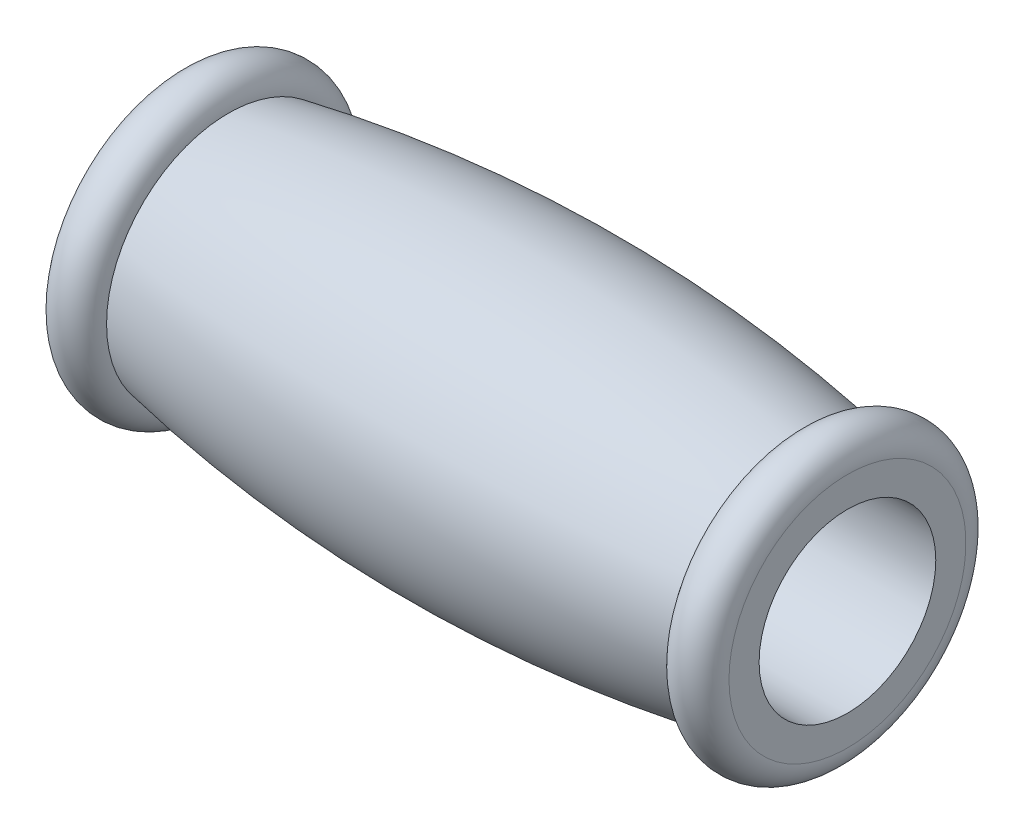
ISO-10303-21;
HEADER;
FILE_DESCRIPTION(('STEP AP214'),'2;1');
FILE_NAME('part.step','',(''),(''),'','','');
FILE_SCHEMA(('AUTOMOTIVE_DESIGN { 1 0 10303 214 1 1 1 1 }'));
ENDSEC;
DATA;
#1=APPLICATION_CONTEXT('core data for automotive mechanical design processes');
#2=APPLICATION_PROTOCOL_DEFINITION('international standard','automotive_design',2000,#1);
#3=PRODUCT_CONTEXT('',#1,'mechanical');
#4=PRODUCT('Part','Part','',(#3));
#5=PRODUCT_RELATED_PRODUCT_CATEGORY('part','',(#4));
#6=PRODUCT_DEFINITION_FORMATION('','',#4);
#7=PRODUCT_DEFINITION_CONTEXT('part definition',#1,'design');
#8=PRODUCT_DEFINITION('design','',#6,#7);
#9=PRODUCT_DEFINITION_SHAPE('','',#8);
#10=(LENGTH_UNIT() NAMED_UNIT(*) SI_UNIT(.MILLI.,.METRE.));
#11=(NAMED_UNIT(*) PLANE_ANGLE_UNIT() SI_UNIT($,.RADIAN.));
#12=(NAMED_UNIT(*) SI_UNIT($,.STERADIAN.) SOLID_ANGLE_UNIT());
#13=UNCERTAINTY_MEASURE_WITH_UNIT(LENGTH_MEASURE(1.E-05),#10,'distance_accuracy_value','');
#14=(GEOMETRIC_REPRESENTATION_CONTEXT(3) GLOBAL_UNCERTAINTY_ASSIGNED_CONTEXT((#13)) GLOBAL_UNIT_ASSIGNED_CONTEXT((#10,
#11,#12)) REPRESENTATION_CONTEXT('',''));
#15=CARTESIAN_POINT('',(0.,0.,0.));
#16=DIRECTION('',(0.,0.,1.));
#17=DIRECTION('',(1.,0.,0.));
#18=AXIS2_PLACEMENT_3D('',#15,#16,#17);
#19=CARTESIAN_POINT('',(-50.,13.2,0.));
#20=DIRECTION('',(1.,0.,0.));
#21=DIRECTION('',(0.,0.,-1.));
#22=AXIS2_PLACEMENT_3D('',#19,#20,#21);
#23=PLANE('',#22);
#24=CARTESIAN_POINT('',(-50.,0.,0.));
#25=DIRECTION('',(-1.,0.,0.));
#26=DIRECTION('',(0.,0.,1.));
#27=AXIS2_PLACEMENT_3D('',#24,#25,#26);
#28=CIRCLE('',#27,13.2);
#29=CARTESIAN_POINT('',(-50.,0.,13.2));
#30=VERTEX_POINT('',#29);
#31=EDGE_CURVE('E10',#30,#30,#28,.T.);
#32=ORIENTED_EDGE('',*,*,#31,.F.);
#33=EDGE_LOOP('',(#32));
#34=FACE_BOUND('',#33,.T.);
#35=CARTESIAN_POINT('',(-50.,0.,0.));
#36=DIRECTION('',(-1.,0.,0.));
#37=DIRECTION('',(0.,0.,1.));
#38=AXIS2_PLACEMENT_3D('',#35,#36,#37);
#39=CIRCLE('',#38,18.2);
#40=CARTESIAN_POINT('',(-50.,0.,18.2));
#41=VERTEX_POINT('',#40);
#42=EDGE_CURVE('E62',#41,#41,#39,.T.);
#43=ORIENTED_EDGE('',*,*,#42,.T.);
#44=EDGE_LOOP('',(#43));
#45=FACE_BOUND('',#44,.T.);
#46=ADVANCED_FACE('F39',(#34,#45),#23,.F.);
#47=CARTESIAN_POINT('',(-100.,0.,0.));
#48=DIRECTION('',(-1.,0.,0.));
#49=DIRECTION('',(0.,0.,1.));
#50=AXIS2_PLACEMENT_3D('',#47,#48,#49);
#51=CYLINDRICAL_SURFACE('',#50,13.2);
#52=CARTESIAN_POINT('',(50.,0.,0.));
#53=DIRECTION('',(-1.,0.,0.));
#54=DIRECTION('',(0.,0.,1.));
#55=AXIS2_PLACEMENT_3D('',#52,#53,#54);
#56=CIRCLE('',#55,13.2);
#57=CARTESIAN_POINT('',(50.,0.,13.2));
#58=VERTEX_POINT('',#57);
#59=EDGE_CURVE('E44',#58,#58,#56,.T.);
#60=ORIENTED_EDGE('',*,*,#59,.F.);
#61=EDGE_LOOP('',(#60));
#62=FACE_BOUND('',#61,.T.);
#63=ORIENTED_EDGE('',*,*,#31,.T.);
#64=EDGE_LOOP('',(#63));
#65=FACE_BOUND('',#64,.T.);
#66=ADVANCED_FACE('F88',(#62,#65),#51,.F.);
#67=CARTESIAN_POINT('',(50.,13.2,0.));
#68=DIRECTION('',(-1.,0.,0.));
#69=DIRECTION('',(0.,0.,1.));
#70=AXIS2_PLACEMENT_3D('',#67,#68,#69);
#71=PLANE('',#70);
#72=CARTESIAN_POINT('',(50.,0.,0.));
#73=DIRECTION('',(-1.,0.,0.));
#74=DIRECTION('',(0.,0.,1.));
#75=AXIS2_PLACEMENT_3D('',#72,#73,#74);
#76=CIRCLE('',#75,17.7);
#77=CARTESIAN_POINT('',(50.,0.,17.7));
#78=VERTEX_POINT('',#77);
#79=EDGE_CURVE('E47',#78,#78,#76,.T.);
#80=ORIENTED_EDGE('',*,*,#79,.F.);
#81=EDGE_LOOP('',(#80));
#82=FACE_BOUND('',#81,.T.);
#83=ORIENTED_EDGE('',*,*,#59,.T.);
#84=EDGE_LOOP('',(#83));
#85=FACE_BOUND('',#84,.T.);
#86=ADVANCED_FACE('F82',(#82,#85),#71,.F.);
#87=CARTESIAN_POINT('',(46.25,0.,0.));
#88=DIRECTION('',(-1.,0.,0.));
#89=DIRECTION('',(0.,0.,1.));
#90=AXIS2_PLACEMENT_3D('',#87,#88,#89);
#91=TOROIDAL_SURFACE('',#90,17.95,3.75832409459322);
#92=CARTESIAN_POINT('',(42.5,0.,0.));
#93=DIRECTION('',(-1.,0.,0.));
#94=DIRECTION('',(0.,0.,1.));
#95=AXIS2_PLACEMENT_3D('',#92,#93,#94);
#96=CIRCLE('',#95,18.2);
#97=CARTESIAN_POINT('',(42.5,0.,18.2));
#98=VERTEX_POINT('',#97);
#99=EDGE_CURVE('E52',#98,#98,#96,.T.);
#100=ORIENTED_EDGE('',*,*,#99,.F.);
#101=EDGE_LOOP('',(#100));
#102=FACE_BOUND('',#101,.T.);
#103=ORIENTED_EDGE('',*,*,#79,.T.);
#104=EDGE_LOOP('',(#103));
#105=FACE_BOUND('',#104,.T.);
#106=ADVANCED_FACE('F73',(#102,#105),#91,.T.);
#107=CARTESIAN_POINT('',(0.,0.,0.));
#108=DIRECTION('',(-1.,0.,0.));
#109=DIRECTION('',(0.,0.,1.));
#110=AXIS2_PLACEMENT_3D('',#107,#108,#109);
#111=DEGENERATE_TOROIDAL_SURFACE('',#110,207.252784180172,229.423642841341,.F.);
#112=CARTESIAN_POINT('',(-42.5,0.,0.));
#113=DIRECTION('',(-1.,0.,0.));
#114=DIRECTION('',(0.,0.,1.));
#115=AXIS2_PLACEMENT_3D('',#112,#113,#114);
#116=CIRCLE('',#115,18.2);
#117=CARTESIAN_POINT('',(-42.5,0.,18.2));
#118=VERTEX_POINT('',#117);
#119=EDGE_CURVE('E59',#118,#118,#116,.T.);
#120=ORIENTED_EDGE('',*,*,#119,.F.);
#121=EDGE_LOOP('',(#120));
#122=FACE_BOUND('',#121,.T.);
#123=ORIENTED_EDGE('',*,*,#99,.T.);
#124=EDGE_LOOP('',(#123));
#125=FACE_BOUND('',#124,.T.);
#126=ADVANCED_FACE('F66',(#122,#125),#111,.F.);
#127=CARTESIAN_POINT('',(-46.25,0.,0.));
#128=DIRECTION('',(-1.,0.,0.));
#129=DIRECTION('',(0.,0.,1.));
#130=AXIS2_PLACEMENT_3D('',#127,#128,#129);
#131=TOROIDAL_SURFACE('',#130,18.2,3.75);
#132=ORIENTED_EDGE('',*,*,#42,.F.);
#133=EDGE_LOOP('',(#132));
#134=FACE_BOUND('',#133,.T.);
#135=ORIENTED_EDGE('',*,*,#119,.T.);
#136=EDGE_LOOP('',(#135));
#137=FACE_BOUND('',#136,.T.);
#138=ADVANCED_FACE('F67',(#134,#137),#131,.T.);
#139=CLOSED_SHELL('',(#46,#66,#86,#106,#126,#138));
#140=MANIFOLD_SOLID_BREP('B2',#139);
#141=ADVANCED_BREP_SHAPE_REPRESENTATION('',(#18,#140),#14);
#142=SHAPE_DEFINITION_REPRESENTATION(#9,#141);
ENDSEC;
END-ISO-10303-21;
